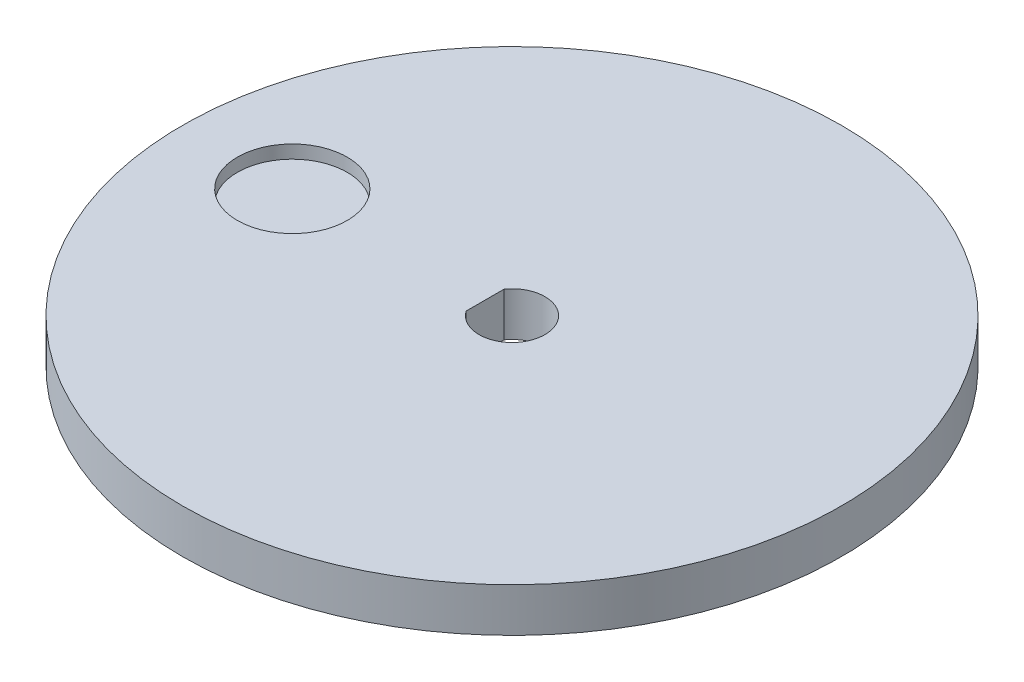
ISO-10303-21;
HEADER;
FILE_DESCRIPTION(('STEP AP214'),'2;1');
FILE_NAME('part.step','',(''),(''),'','','');
FILE_SCHEMA(('AUTOMOTIVE_DESIGN { 1 0 10303 214 1 1 1 1 }'));
ENDSEC;
DATA;
#1=APPLICATION_CONTEXT('core data for automotive mechanical design processes');
#2=APPLICATION_PROTOCOL_DEFINITION('international standard','automotive_design',2000,#1);
#3=PRODUCT_CONTEXT('',#1,'mechanical');
#4=PRODUCT('Part','Part','',(#3));
#5=PRODUCT_RELATED_PRODUCT_CATEGORY('part','',(#4));
#6=PRODUCT_DEFINITION_FORMATION('','',#4);
#7=PRODUCT_DEFINITION_CONTEXT('part definition',#1,'design');
#8=PRODUCT_DEFINITION('design','',#6,#7);
#9=PRODUCT_DEFINITION_SHAPE('','',#8);
#10=(LENGTH_UNIT() NAMED_UNIT(*) SI_UNIT(.MILLI.,.METRE.));
#11=(NAMED_UNIT(*) PLANE_ANGLE_UNIT() SI_UNIT($,.RADIAN.));
#12=(NAMED_UNIT(*) SI_UNIT($,.STERADIAN.) SOLID_ANGLE_UNIT());
#13=UNCERTAINTY_MEASURE_WITH_UNIT(LENGTH_MEASURE(1.E-05),#10,'distance_accuracy_value','');
#14=(GEOMETRIC_REPRESENTATION_CONTEXT(3) GLOBAL_UNCERTAINTY_ASSIGNED_CONTEXT((#13)) GLOBAL_UNIT_ASSIGNED_CONTEXT((#10,
#11,#12)) REPRESENTATION_CONTEXT('',''));
#15=CARTESIAN_POINT('',(0.,0.,0.));
#16=DIRECTION('',(0.,0.,1.));
#17=DIRECTION('',(1.,0.,0.));
#18=AXIS2_PLACEMENT_3D('',#15,#16,#17);
#19=CARTESIAN_POINT('',(0.,4.,0.));
#20=DIRECTION('',(0.,1.,0.));
#21=DIRECTION('',(0.,0.,1.));
#22=AXIS2_PLACEMENT_3D('',#19,#20,#21);
#23=PLANE('',#22);
#24=CARTESIAN_POINT('',(-20.,4.,0.));
#25=DIRECTION('',(0.,1.,0.));
#26=DIRECTION('',(0.,0.,1.));
#27=AXIS2_PLACEMENT_3D('',#24,#25,#26);
#28=CIRCLE('',#27,5.);
#29=CARTESIAN_POINT('',(-20.,4.,5.));
#30=VERTEX_POINT('',#29);
#31=EDGE_CURVE('E85',#30,#30,#28,.T.);
#32=ORIENTED_EDGE('',*,*,#31,.F.);
#33=EDGE_LOOP('',(#32));
#34=FACE_BOUND('',#33,.T.);
#35=CARTESIAN_POINT('',(0.,4.,0.));
#36=DIRECTION('',(0.,1.,0.));
#37=DIRECTION('',(0.,0.,1.));
#38=AXIS2_PLACEMENT_3D('',#35,#36,#37);
#39=CIRCLE('',#38,30.);
#40=CARTESIAN_POINT('',(0.,4.,30.));
#41=VERTEX_POINT('',#40);
#42=EDGE_CURVE('E11',#41,#41,#39,.T.);
#43=ORIENTED_EDGE('',*,*,#42,.T.);
#44=EDGE_LOOP('',(#43));
#45=FACE_BOUND('',#44,.T.);
#46=DIRECTION('',(0.,0.,1.));
#47=VECTOR('',#46,1.);
#48=CARTESIAN_POINT('',(-2.45,4.,0.));
#49=LINE('',#48,#47);
#50=CARTESIAN_POINT('',(-2.45,4.,-1.73132896931808));
#51=VERTEX_POINT('',#50);
#52=CARTESIAN_POINT('',(-2.45,4.,1.73132896931808));
#53=VERTEX_POINT('',#52);
#54=EDGE_CURVE('E78',#51,#53,#49,.T.);
#55=ORIENTED_EDGE('',*,*,#54,.F.);
#56=CARTESIAN_POINT('',(0.,4.,0.));
#57=DIRECTION('',(0.,1.,0.));
#58=DIRECTION('',(0.,0.,1.));
#59=AXIS2_PLACEMENT_3D('',#56,#57,#58);
#60=CIRCLE('',#59,3.);
#61=EDGE_CURVE('E68',#53,#51,#60,.T.);
#62=ORIENTED_EDGE('',*,*,#61,.F.);
#63=EDGE_LOOP('',(#55,#62));
#64=FACE_BOUND('',#63,.T.);
#65=ADVANCED_FACE('F39',(#34,#45,#64),#23,.T.);
#66=CARTESIAN_POINT('',(0.,0.,0.));
#67=DIRECTION('',(0.,1.,0.));
#68=DIRECTION('',(0.,0.,1.));
#69=AXIS2_PLACEMENT_3D('',#66,#67,#68);
#70=PLANE('',#69);
#71=CARTESIAN_POINT('',(0.,0.,0.));
#72=DIRECTION('',(0.,1.,0.));
#73=DIRECTION('',(0.,0.,1.));
#74=AXIS2_PLACEMENT_3D('',#71,#72,#73);
#75=CIRCLE('',#74,30.);
#76=CARTESIAN_POINT('',(0.,0.,30.));
#77=VERTEX_POINT('',#76);
#78=EDGE_CURVE('E43',#77,#77,#75,.T.);
#79=ORIENTED_EDGE('',*,*,#78,.F.);
#80=EDGE_LOOP('',(#79));
#81=FACE_BOUND('',#80,.T.);
#82=CARTESIAN_POINT('',(0.,0.,0.));
#83=DIRECTION('',(0.,1.,0.));
#84=DIRECTION('',(0.,0.,1.));
#85=AXIS2_PLACEMENT_3D('',#82,#83,#84);
#86=CIRCLE('',#85,3.);
#87=CARTESIAN_POINT('',(-2.45,0.,1.73132896931808));
#88=VERTEX_POINT('',#87);
#89=CARTESIAN_POINT('',(-2.45,0.,-1.73132896931808));
#90=VERTEX_POINT('',#89);
#91=EDGE_CURVE('E70',#88,#90,#86,.T.);
#92=ORIENTED_EDGE('',*,*,#91,.T.);
#93=DIRECTION('',(0.,0.,1.));
#94=VECTOR('',#93,1.);
#95=CARTESIAN_POINT('',(-2.45,0.,-1.73132896931808));
#96=LINE('',#95,#94);
#97=EDGE_CURVE('E71',#90,#88,#96,.T.);
#98=ORIENTED_EDGE('',*,*,#97,.T.);
#99=EDGE_LOOP('',(#92,#98));
#100=FACE_BOUND('',#99,.T.);
#101=ADVANCED_FACE('F76',(#81,#100),#70,.F.);
#102=CARTESIAN_POINT('',(0.,4.,0.));
#103=DIRECTION('',(0.,-1.,0.));
#104=DIRECTION('',(0.,0.,-1.));
#105=AXIS2_PLACEMENT_3D('',#102,#103,#104);
#106=CYLINDRICAL_SURFACE('',#105,30.);
#107=ORIENTED_EDGE('',*,*,#42,.F.);
#108=EDGE_LOOP('',(#107));
#109=FACE_BOUND('',#108,.T.);
#110=ORIENTED_EDGE('',*,*,#78,.T.);
#111=EDGE_LOOP('',(#110));
#112=FACE_BOUND('',#111,.T.);
#113=ADVANCED_FACE('F41',(#109,#112),#106,.T.);
#114=CARTESIAN_POINT('',(0.,4.,0.));
#115=DIRECTION('',(0.,-1.,0.));
#116=DIRECTION('',(0.,0.,-1.));
#117=AXIS2_PLACEMENT_3D('',#114,#115,#116);
#118=CYLINDRICAL_SURFACE('',#117,3.);
#119=ORIENTED_EDGE('',*,*,#91,.F.);
#120=DIRECTION('',(0.,-1.,0.));
#121=VECTOR('',#120,1.);
#122=CARTESIAN_POINT('',(-2.45,4.,1.73132896931808));
#123=LINE('',#122,#121);
#124=EDGE_CURVE('E56',#53,#88,#123,.T.);
#125=ORIENTED_EDGE('',*,*,#124,.F.);
#126=ORIENTED_EDGE('',*,*,#61,.T.);
#127=DIRECTION('',(0.,-1.,0.));
#128=VECTOR('',#127,1.);
#129=CARTESIAN_POINT('',(-2.45,4.,-1.73132896931808));
#130=LINE('',#129,#128);
#131=EDGE_CURVE('E53',#51,#90,#130,.T.);
#132=ORIENTED_EDGE('',*,*,#131,.T.);
#133=EDGE_LOOP('',(#119,#125,#126,#132));
#134=FACE_BOUND('',#133,.T.);
#135=ADVANCED_FACE('F64',(#134),#118,.F.);
#136=CARTESIAN_POINT('',(-2.45,4.,-1.73132896931808));
#137=DIRECTION('',(1.,0.,0.));
#138=DIRECTION('',(0.,0.,-1.));
#139=AXIS2_PLACEMENT_3D('',#136,#137,#138);
#140=PLANE('',#139);
#141=ORIENTED_EDGE('',*,*,#97,.F.);
#142=ORIENTED_EDGE('',*,*,#131,.F.);
#143=ORIENTED_EDGE('',*,*,#54,.T.);
#144=ORIENTED_EDGE('',*,*,#124,.T.);
#145=EDGE_LOOP('',(#141,#142,#143,#144));
#146=FACE_BOUND('',#145,.T.);
#147=ADVANCED_FACE('F72',(#146),#140,.T.);
#148=CARTESIAN_POINT('',(-20.,2.8,0.));
#149=DIRECTION('',(0.,1.,0.));
#150=DIRECTION('',(0.,0.,1.));
#151=AXIS2_PLACEMENT_3D('',#148,#149,#150);
#152=CYLINDRICAL_SURFACE('',#151,5.);
#153=CARTESIAN_POINT('',(-20.,2.8,0.));
#154=DIRECTION('',(0.,1.,0.));
#155=DIRECTION('',(0.,0.,1.));
#156=AXIS2_PLACEMENT_3D('',#153,#154,#155);
#157=CIRCLE('',#156,5.);
#158=CARTESIAN_POINT('',(-20.,2.8,5.));
#159=VERTEX_POINT('',#158);
#160=EDGE_CURVE('E80',#159,#159,#157,.T.);
#161=ORIENTED_EDGE('',*,*,#160,.F.);
#162=EDGE_LOOP('',(#161));
#163=FACE_BOUND('',#162,.T.);
#164=ORIENTED_EDGE('',*,*,#31,.T.);
#165=EDGE_LOOP('',(#164));
#166=FACE_BOUND('',#165,.T.);
#167=ADVANCED_FACE('F101',(#163,#166),#152,.F.);
#168=CARTESIAN_POINT('',(-20.,2.8,0.));
#169=DIRECTION('',(0.,1.,0.));
#170=DIRECTION('',(0.,0.,1.));
#171=AXIS2_PLACEMENT_3D('',#168,#169,#170);
#172=PLANE('',#171);
#173=ORIENTED_EDGE('',*,*,#160,.T.);
#174=EDGE_LOOP('',(#173));
#175=FACE_BOUND('',#174,.T.);
#176=ADVANCED_FACE('F110',(#175),#172,.T.);
#177=CLOSED_SHELL('',(#65,#101,#113,#135,#147,#167,#176));
#178=MANIFOLD_SOLID_BREP('B2',#177);
#179=ADVANCED_BREP_SHAPE_REPRESENTATION('',(#18,#178),#14);
#180=SHAPE_DEFINITION_REPRESENTATION(#9,#179);
ENDSEC;
END-ISO-10303-21;
